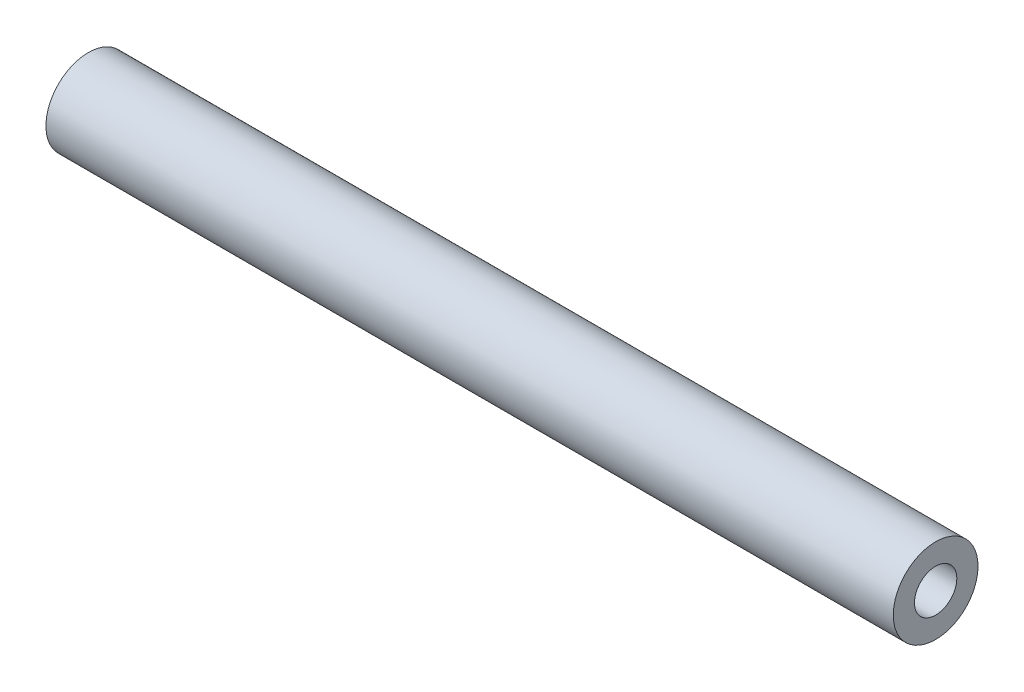
ISO-10303-21;
HEADER;
FILE_DESCRIPTION(('STEP AP214'),'2;1');
FILE_NAME('part.step','',(''),(''),'','','');
FILE_SCHEMA(('AUTOMOTIVE_DESIGN { 1 0 10303 214 1 1 1 1 }'));
ENDSEC;
DATA;
#1=APPLICATION_CONTEXT('core data for automotive mechanical design processes');
#2=APPLICATION_PROTOCOL_DEFINITION('international standard','automotive_design',2000,#1);
#3=PRODUCT_CONTEXT('',#1,'mechanical');
#4=PRODUCT('Part','Part','',(#3));
#5=PRODUCT_RELATED_PRODUCT_CATEGORY('part','',(#4));
#6=PRODUCT_DEFINITION_FORMATION('','',#4);
#7=PRODUCT_DEFINITION_CONTEXT('part definition',#1,'design');
#8=PRODUCT_DEFINITION('design','',#6,#7);
#9=PRODUCT_DEFINITION_SHAPE('','',#8);
#10=(LENGTH_UNIT() NAMED_UNIT(*) SI_UNIT(.MILLI.,.METRE.));
#11=(NAMED_UNIT(*) PLANE_ANGLE_UNIT() SI_UNIT($,.RADIAN.));
#12=(NAMED_UNIT(*) SI_UNIT($,.STERADIAN.) SOLID_ANGLE_UNIT());
#13=UNCERTAINTY_MEASURE_WITH_UNIT(LENGTH_MEASURE(1.E-05),#10,'distance_accuracy_value','');
#14=(GEOMETRIC_REPRESENTATION_CONTEXT(3) GLOBAL_UNCERTAINTY_ASSIGNED_CONTEXT((#13)) GLOBAL_UNIT_ASSIGNED_CONTEXT((#10,
#11,#12)) REPRESENTATION_CONTEXT('',''));
#15=CARTESIAN_POINT('',(0.,0.,0.));
#16=DIRECTION('',(0.,0.,1.));
#17=DIRECTION('',(1.,0.,0.));
#18=AXIS2_PLACEMENT_3D('',#15,#16,#17);
#19=CARTESIAN_POINT('',(31.75,0.,0.));
#20=DIRECTION('',(-1.,0.,0.));
#21=DIRECTION('',(0.,0.,1.));
#22=AXIS2_PLACEMENT_3D('',#19,#20,#21);
#23=CYLINDRICAL_SURFACE('',#22,3.175);
#24=CARTESIAN_POINT('',(31.75,0.,0.));
#25=DIRECTION('',(1.,0.,0.));
#26=DIRECTION('',(0.,0.,-1.));
#27=AXIS2_PLACEMENT_3D('',#24,#25,#26);
#28=CIRCLE('',#27,3.175);
#29=CARTESIAN_POINT('',(31.75,0.,-3.175));
#30=VERTEX_POINT('',#29);
#31=EDGE_CURVE('E10',#30,#30,#28,.T.);
#32=ORIENTED_EDGE('',*,*,#31,.F.);
#33=EDGE_LOOP('',(#32));
#34=FACE_BOUND('',#33,.T.);
#35=CARTESIAN_POINT('',(-31.75,0.,0.));
#36=DIRECTION('',(1.,0.,0.));
#37=DIRECTION('',(0.,0.,-1.));
#38=AXIS2_PLACEMENT_3D('',#35,#36,#37);
#39=CIRCLE('',#38,3.175);
#40=CARTESIAN_POINT('',(-31.75,0.,-3.175));
#41=VERTEX_POINT('',#40);
#42=EDGE_CURVE('E36',#41,#41,#39,.T.);
#43=ORIENTED_EDGE('',*,*,#42,.T.);
#44=EDGE_LOOP('',(#43));
#45=FACE_BOUND('',#44,.T.);
#46=ADVANCED_FACE('F33',(#34,#45),#23,.T.);
#47=CARTESIAN_POINT('',(31.75,0.,0.));
#48=DIRECTION('',(1.,0.,0.));
#49=DIRECTION('',(0.,0.,-1.));
#50=AXIS2_PLACEMENT_3D('',#47,#48,#49);
#51=PLANE('',#50);
#52=CARTESIAN_POINT('',(31.75,0.,0.));
#53=DIRECTION('',(1.,0.,0.));
#54=DIRECTION('',(0.,0.,-1.));
#55=AXIS2_PLACEMENT_3D('',#52,#53,#54);
#56=CIRCLE('',#55,1.5875);
#57=CARTESIAN_POINT('',(31.75,0.,-1.5875));
#58=VERTEX_POINT('',#57);
#59=EDGE_CURVE('E45',#58,#58,#56,.T.);
#60=ORIENTED_EDGE('',*,*,#59,.F.);
#61=EDGE_LOOP('',(#60));
#62=FACE_BOUND('',#61,.T.);
#63=ORIENTED_EDGE('',*,*,#31,.T.);
#64=EDGE_LOOP('',(#63));
#65=FACE_BOUND('',#64,.T.);
#66=ADVANCED_FACE('F60',(#62,#65),#51,.T.);
#67=CARTESIAN_POINT('',(-31.75,0.,0.));
#68=DIRECTION('',(1.,0.,0.));
#69=DIRECTION('',(0.,0.,-1.));
#70=AXIS2_PLACEMENT_3D('',#67,#68,#69);
#71=PLANE('',#70);
#72=CARTESIAN_POINT('',(-31.75,0.,0.));
#73=DIRECTION('',(1.,0.,0.));
#74=DIRECTION('',(0.,0.,-1.));
#75=AXIS2_PLACEMENT_3D('',#72,#73,#74);
#76=CIRCLE('',#75,1.5875);
#77=CARTESIAN_POINT('',(-31.75,0.,-1.5875));
#78=VERTEX_POINT('',#77);
#79=EDGE_CURVE('E43',#78,#78,#76,.T.);
#80=ORIENTED_EDGE('',*,*,#79,.T.);
#81=EDGE_LOOP('',(#80));
#82=FACE_BOUND('',#81,.T.);
#83=ORIENTED_EDGE('',*,*,#42,.F.);
#84=EDGE_LOOP('',(#83));
#85=FACE_BOUND('',#84,.T.);
#86=ADVANCED_FACE('F51',(#82,#85),#71,.F.);
#87=CARTESIAN_POINT('',(-31.75,0.,0.));
#88=DIRECTION('',(1.,0.,0.));
#89=DIRECTION('',(0.,0.,-1.));
#90=AXIS2_PLACEMENT_3D('',#87,#88,#89);
#91=CYLINDRICAL_SURFACE('',#90,1.5875);
#92=ORIENTED_EDGE('',*,*,#79,.F.);
#93=EDGE_LOOP('',(#92));
#94=FACE_BOUND('',#93,.T.);
#95=ORIENTED_EDGE('',*,*,#59,.T.);
#96=EDGE_LOOP('',(#95));
#97=FACE_BOUND('',#96,.T.);
#98=ADVANCED_FACE('F54',(#94,#97),#91,.F.);
#99=CLOSED_SHELL('',(#46,#66,#86,#98));
#100=MANIFOLD_SOLID_BREP('B2',#99);
#101=ADVANCED_BREP_SHAPE_REPRESENTATION('',(#18,#100),#14);
#102=SHAPE_DEFINITION_REPRESENTATION(#9,#101);
ENDSEC;
END-ISO-10303-21;
